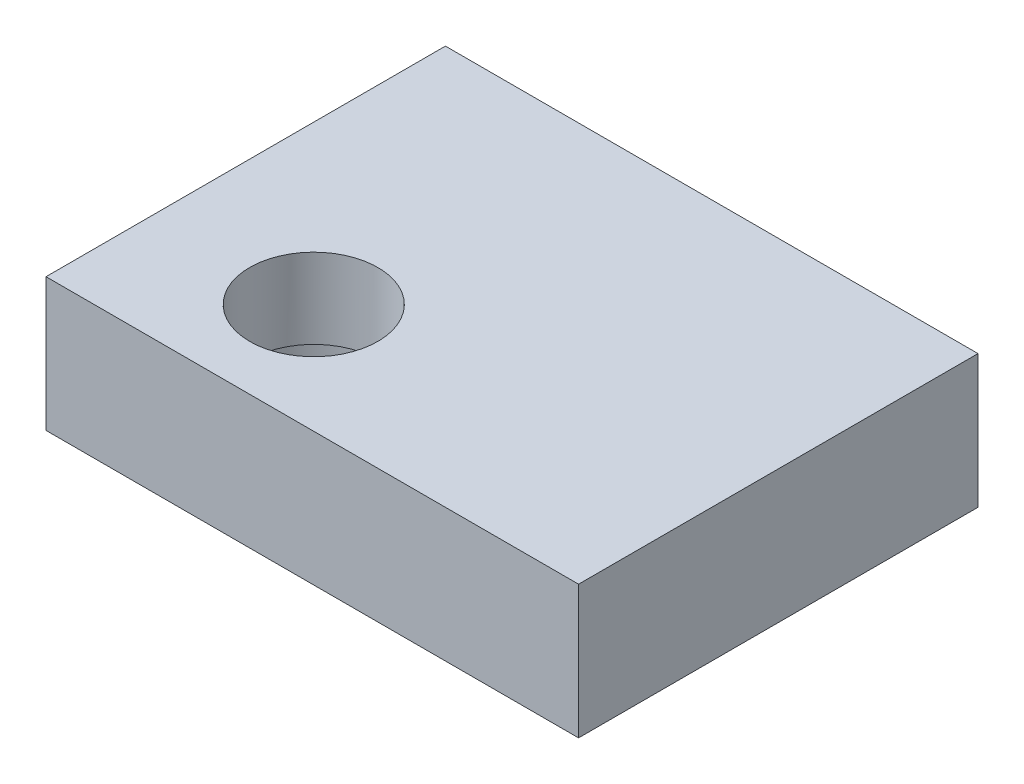
ISO-10303-21;
HEADER;
FILE_DESCRIPTION(('STEP AP214'),'2;1');
FILE_NAME('part.step','',(''),(''),'','','');
FILE_SCHEMA(('AUTOMOTIVE_DESIGN { 1 0 10303 214 1 1 1 1 }'));
ENDSEC;
DATA;
#1=APPLICATION_CONTEXT('core data for automotive mechanical design processes');
#2=APPLICATION_PROTOCOL_DEFINITION('international standard','automotive_design',2000,#1);
#3=PRODUCT_CONTEXT('',#1,'mechanical');
#4=PRODUCT('Part','Part','',(#3));
#5=PRODUCT_RELATED_PRODUCT_CATEGORY('part','',(#4));
#6=PRODUCT_DEFINITION_FORMATION('','',#4);
#7=PRODUCT_DEFINITION_CONTEXT('part definition',#1,'design');
#8=PRODUCT_DEFINITION('design','',#6,#7);
#9=PRODUCT_DEFINITION_SHAPE('','',#8);
#10=(LENGTH_UNIT() NAMED_UNIT(*) SI_UNIT(.MILLI.,.METRE.));
#11=(NAMED_UNIT(*) PLANE_ANGLE_UNIT() SI_UNIT($,.RADIAN.));
#12=(NAMED_UNIT(*) SI_UNIT($,.STERADIAN.) SOLID_ANGLE_UNIT());
#13=UNCERTAINTY_MEASURE_WITH_UNIT(LENGTH_MEASURE(1.E-05),#10,'distance_accuracy_value','');
#14=(GEOMETRIC_REPRESENTATION_CONTEXT(3) GLOBAL_UNCERTAINTY_ASSIGNED_CONTEXT((#13)) GLOBAL_UNIT_ASSIGNED_CONTEXT((#10,
#11,#12)) REPRESENTATION_CONTEXT('',''));
#15=CARTESIAN_POINT('',(0.,0.,0.));
#16=DIRECTION('',(0.,0.,1.));
#17=DIRECTION('',(1.,0.,0.));
#18=AXIS2_PLACEMENT_3D('',#15,#16,#17);
#19=CARTESIAN_POINT('',(20.,10.,15.));
#20=DIRECTION('',(-1.,0.,0.));
#21=DIRECTION('',(0.,0.,1.));
#22=AXIS2_PLACEMENT_3D('',#19,#20,#21);
#23=PLANE('',#22);
#24=DIRECTION('',(0.,0.,-1.));
#25=VECTOR('',#24,1.);
#26=CARTESIAN_POINT('',(20.,0.,15.));
#27=LINE('',#26,#25);
#28=CARTESIAN_POINT('',(20.,0.,15.));
#29=VERTEX_POINT('',#28);
#30=CARTESIAN_POINT('',(20.,0.,-15.));
#31=VERTEX_POINT('',#30);
#32=EDGE_CURVE('E113',#29,#31,#27,.T.);
#33=ORIENTED_EDGE('',*,*,#32,.T.);
#34=DIRECTION('',(0.,-1.,0.));
#35=VECTOR('',#34,1.);
#36=CARTESIAN_POINT('',(20.,10.,-15.));
#37=LINE('',#36,#35);
#38=CARTESIAN_POINT('',(20.,10.,-15.));
#39=VERTEX_POINT('',#38);
#40=EDGE_CURVE('E11',#39,#31,#37,.T.);
#41=ORIENTED_EDGE('',*,*,#40,.F.);
#42=DIRECTION('',(0.,0.,-1.));
#43=VECTOR('',#42,1.);
#44=CARTESIAN_POINT('',(20.,10.,15.));
#45=LINE('',#44,#43);
#46=CARTESIAN_POINT('',(20.,10.,15.));
#47=VERTEX_POINT('',#46);
#48=EDGE_CURVE('E96',#47,#39,#45,.T.);
#49=ORIENTED_EDGE('',*,*,#48,.F.);
#50=DIRECTION('',(0.,-1.,0.));
#51=VECTOR('',#50,1.);
#52=CARTESIAN_POINT('',(20.,10.,15.));
#53=LINE('',#52,#51);
#54=EDGE_CURVE('E109',#47,#29,#53,.T.);
#55=ORIENTED_EDGE('',*,*,#54,.T.);
#56=EDGE_LOOP('',(#33,#41,#49,#55));
#57=FACE_BOUND('',#56,.T.);
#58=ADVANCED_FACE('F43',(#57),#23,.F.);
#59=CARTESIAN_POINT('',(-20.,10.,-15.));
#60=DIRECTION('',(0.,0.,1.));
#61=DIRECTION('',(1.,0.,0.));
#62=AXIS2_PLACEMENT_3D('',#59,#60,#61);
#63=PLANE('',#62);
#64=DIRECTION('',(-1.,0.,0.));
#65=VECTOR('',#64,1.);
#66=CARTESIAN_POINT('',(-20.,0.,-15.));
#67=LINE('',#66,#65);
#68=CARTESIAN_POINT('',(-20.,0.,-15.));
#69=VERTEX_POINT('',#68);
#70=EDGE_CURVE('E101',#31,#69,#67,.T.);
#71=ORIENTED_EDGE('',*,*,#70,.T.);
#72=DIRECTION('',(0.,-1.,0.));
#73=VECTOR('',#72,1.);
#74=CARTESIAN_POINT('',(-20.,10.,-15.));
#75=LINE('',#74,#73);
#76=CARTESIAN_POINT('',(-20.,10.,-15.));
#77=VERTEX_POINT('',#76);
#78=EDGE_CURVE('E53',#77,#69,#75,.T.);
#79=ORIENTED_EDGE('',*,*,#78,.F.);
#80=DIRECTION('',(-1.,0.,0.));
#81=VECTOR('',#80,1.);
#82=CARTESIAN_POINT('',(-20.,10.,-15.));
#83=LINE('',#82,#81);
#84=EDGE_CURVE('E91',#39,#77,#83,.T.);
#85=ORIENTED_EDGE('',*,*,#84,.F.);
#86=ORIENTED_EDGE('',*,*,#40,.T.);
#87=EDGE_LOOP('',(#71,#79,#85,#86));
#88=FACE_BOUND('',#87,.T.);
#89=ADVANCED_FACE('F100',(#88),#63,.F.);
#90=CARTESIAN_POINT('',(-20.,10.,15.));
#91=DIRECTION('',(1.,0.,0.));
#92=DIRECTION('',(0.,0.,-1.));
#93=AXIS2_PLACEMENT_3D('',#90,#91,#92);
#94=PLANE('',#93);
#95=DIRECTION('',(0.,0.,1.));
#96=VECTOR('',#95,1.);
#97=CARTESIAN_POINT('',(-20.,0.,15.));
#98=LINE('',#97,#96);
#99=CARTESIAN_POINT('',(-20.,0.,15.));
#100=VERTEX_POINT('',#99);
#101=EDGE_CURVE('E78',#69,#100,#98,.T.);
#102=ORIENTED_EDGE('',*,*,#101,.T.);
#103=DIRECTION('',(0.,-1.,0.));
#104=VECTOR('',#103,1.);
#105=CARTESIAN_POINT('',(-20.,10.,15.));
#106=LINE('',#105,#104);
#107=CARTESIAN_POINT('',(-20.,10.,15.));
#108=VERTEX_POINT('',#107);
#109=EDGE_CURVE('E103',#108,#100,#106,.T.);
#110=ORIENTED_EDGE('',*,*,#109,.F.);
#111=DIRECTION('',(0.,0.,1.));
#112=VECTOR('',#111,1.);
#113=CARTESIAN_POINT('',(-20.,10.,15.));
#114=LINE('',#113,#112);
#115=EDGE_CURVE('E94',#77,#108,#114,.T.);
#116=ORIENTED_EDGE('',*,*,#115,.F.);
#117=ORIENTED_EDGE('',*,*,#78,.T.);
#118=EDGE_LOOP('',(#102,#110,#116,#117));
#119=FACE_BOUND('',#118,.T.);
#120=ADVANCED_FACE('F105',(#119),#94,.F.);
#121=CARTESIAN_POINT('',(-20.,10.,15.));
#122=DIRECTION('',(0.,0.,-1.));
#123=DIRECTION('',(-1.,0.,0.));
#124=AXIS2_PLACEMENT_3D('',#121,#122,#123);
#125=PLANE('',#124);
#126=DIRECTION('',(1.,0.,0.));
#127=VECTOR('',#126,1.);
#128=CARTESIAN_POINT('',(-20.,0.,15.));
#129=LINE('',#128,#127);
#130=EDGE_CURVE('E84',#100,#29,#129,.T.);
#131=ORIENTED_EDGE('',*,*,#130,.T.);
#132=ORIENTED_EDGE('',*,*,#54,.F.);
#133=DIRECTION('',(1.,0.,0.));
#134=VECTOR('',#133,1.);
#135=CARTESIAN_POINT('',(-20.,10.,15.));
#136=LINE('',#135,#134);
#137=EDGE_CURVE('E61',#108,#47,#136,.T.);
#138=ORIENTED_EDGE('',*,*,#137,.F.);
#139=ORIENTED_EDGE('',*,*,#109,.T.);
#140=EDGE_LOOP('',(#131,#132,#138,#139));
#141=FACE_BOUND('',#140,.T.);
#142=ADVANCED_FACE('F127',(#141),#125,.F.);
#143=CARTESIAN_POINT('',(0.,10.,0.));
#144=DIRECTION('',(0.,-1.,0.));
#145=DIRECTION('',(0.,0.,-1.));
#146=AXIS2_PLACEMENT_3D('',#143,#144,#145);
#147=PLANE('',#146);
#148=CARTESIAN_POINT('',(-8.14,10.,6.75));
#149=DIRECTION('',(0.,1.,0.));
#150=DIRECTION('',(0.,0.,1.));
#151=AXIS2_PLACEMENT_3D('',#148,#149,#150);
#152=CIRCLE('',#151,4.8125);
#153=CARTESIAN_POINT('',(-8.14,10.,11.5625));
#154=VERTEX_POINT('',#153);
#155=EDGE_CURVE('E165',#154,#154,#152,.T.);
#156=ORIENTED_EDGE('',*,*,#155,.F.);
#157=EDGE_LOOP('',(#156));
#158=FACE_BOUND('',#157,.T.);
#159=ORIENTED_EDGE('',*,*,#48,.T.);
#160=ORIENTED_EDGE('',*,*,#84,.T.);
#161=ORIENTED_EDGE('',*,*,#115,.T.);
#162=ORIENTED_EDGE('',*,*,#137,.T.);
#163=EDGE_LOOP('',(#159,#160,#161,#162));
#164=FACE_BOUND('',#163,.T.);
#165=ADVANCED_FACE('F92',(#158,#164),#147,.F.);
#166=CARTESIAN_POINT('',(0.,0.,0.));
#167=DIRECTION('',(0.,-1.,0.));
#168=DIRECTION('',(0.,0.,-1.));
#169=AXIS2_PLACEMENT_3D('',#166,#167,#168);
#170=PLANE('',#169);
#171=CARTESIAN_POINT('',(-8.14,0.,6.75));
#172=DIRECTION('',(0.,-1.,0.));
#173=DIRECTION('',(0.,0.,-1.));
#174=AXIS2_PLACEMENT_3D('',#171,#172,#173);
#175=CIRCLE('',#174,6.3);
#176=CARTESIAN_POINT('',(-8.14,0.,0.449999999999997));
#177=VERTEX_POINT('',#176);
#178=EDGE_CURVE('E146',#177,#177,#175,.T.);
#179=ORIENTED_EDGE('',*,*,#178,.F.);
#180=EDGE_LOOP('',(#179));
#181=FACE_BOUND('',#180,.T.);
#182=CARTESIAN_POINT('',(-13.3333333333333,0.,-10.));
#183=DIRECTION('',(0.,-1.,0.));
#184=DIRECTION('',(0.,0.,-1.));
#185=AXIS2_PLACEMENT_3D('',#182,#183,#184);
#186=CIRCLE('',#185,1.55);
#187=CARTESIAN_POINT('',(-13.3333333333333,0.,-11.55));
#188=VERTEX_POINT('',#187);
#189=EDGE_CURVE('E154',#188,#188,#186,.T.);
#190=ORIENTED_EDGE('',*,*,#189,.F.);
#191=EDGE_LOOP('',(#190));
#192=FACE_BOUND('',#191,.T.);
#193=CARTESIAN_POINT('',(13.3333333333333,0.,-10.));
#194=DIRECTION('',(0.,-1.,0.));
#195=DIRECTION('',(0.,0.,1.));
#196=AXIS2_PLACEMENT_3D('',#193,#194,#195);
#197=CIRCLE('',#196,1.55);
#198=CARTESIAN_POINT('',(13.3333333333333,0.,-8.45));
#199=VERTEX_POINT('',#198);
#200=EDGE_CURVE('E138',#199,#199,#197,.T.);
#201=ORIENTED_EDGE('',*,*,#200,.F.);
#202=EDGE_LOOP('',(#201));
#203=FACE_BOUND('',#202,.T.);
#204=CARTESIAN_POINT('',(13.3333333333333,0.,10.));
#205=DIRECTION('',(0.,-1.,0.));
#206=DIRECTION('',(0.,0.,-1.));
#207=AXIS2_PLACEMENT_3D('',#204,#205,#206);
#208=CIRCLE('',#207,1.55);
#209=CARTESIAN_POINT('',(13.3333333333333,0.,8.45));
#210=VERTEX_POINT('',#209);
#211=EDGE_CURVE('E134',#210,#210,#208,.T.);
#212=ORIENTED_EDGE('',*,*,#211,.F.);
#213=EDGE_LOOP('',(#212));
#214=FACE_BOUND('',#213,.T.);
#215=ORIENTED_EDGE('',*,*,#32,.F.);
#216=ORIENTED_EDGE('',*,*,#130,.F.);
#217=ORIENTED_EDGE('',*,*,#101,.F.);
#218=ORIENTED_EDGE('',*,*,#70,.F.);
#219=EDGE_LOOP('',(#215,#216,#217,#218));
#220=FACE_BOUND('',#219,.T.);
#221=ADVANCED_FACE('F130',(#181,#192,#203,#214,#220),#170,.T.);
#222=CARTESIAN_POINT('',(13.3333333333333,4.,10.));
#223=DIRECTION('',(0.,-1.,0.));
#224=DIRECTION('',(0.,0.,-1.));
#225=AXIS2_PLACEMENT_3D('',#222,#223,#224);
#226=CYLINDRICAL_SURFACE('',#225,1.55);
#227=CARTESIAN_POINT('',(13.3333333333333,4.,10.));
#228=DIRECTION('',(0.,-1.,0.));
#229=DIRECTION('',(0.,0.,-1.));
#230=AXIS2_PLACEMENT_3D('',#227,#228,#229);
#231=CIRCLE('',#230,1.55);
#232=CARTESIAN_POINT('',(13.3333333333333,4.,8.45));
#233=VERTEX_POINT('',#232);
#234=EDGE_CURVE('E117',#233,#233,#231,.T.);
#235=ORIENTED_EDGE('',*,*,#234,.F.);
#236=EDGE_LOOP('',(#235));
#237=FACE_BOUND('',#236,.T.);
#238=ORIENTED_EDGE('',*,*,#211,.T.);
#239=EDGE_LOOP('',(#238));
#240=FACE_BOUND('',#239,.T.);
#241=ADVANCED_FACE('F191',(#237,#240),#226,.F.);
#242=CARTESIAN_POINT('',(13.3333333333333,4.,10.));
#243=DIRECTION('',(0.,-1.,0.));
#244=DIRECTION('',(0.,0.,-1.));
#245=AXIS2_PLACEMENT_3D('',#242,#243,#244);
#246=PLANE('',#245);
#247=ORIENTED_EDGE('',*,*,#234,.T.);
#248=EDGE_LOOP('',(#247));
#249=FACE_BOUND('',#248,.T.);
#250=ADVANCED_FACE('F200',(#249),#246,.T.);
#251=CARTESIAN_POINT('',(13.3333333333333,4.,-10.));
#252=DIRECTION('',(0.,-1.,0.));
#253=DIRECTION('',(0.,0.,-1.));
#254=AXIS2_PLACEMENT_3D('',#251,#252,#253);
#255=CYLINDRICAL_SURFACE('',#254,1.55);
#256=CARTESIAN_POINT('',(13.3333333333333,4.,-10.));
#257=DIRECTION('',(0.,-1.,0.));
#258=DIRECTION('',(0.,0.,1.));
#259=AXIS2_PLACEMENT_3D('',#256,#257,#258);
#260=CIRCLE('',#259,1.55);
#261=CARTESIAN_POINT('',(13.3333333333333,4.,-8.45));
#262=VERTEX_POINT('',#261);
#263=EDGE_CURVE('E158',#262,#262,#260,.T.);
#264=ORIENTED_EDGE('',*,*,#263,.F.);
#265=EDGE_LOOP('',(#264));
#266=FACE_BOUND('',#265,.T.);
#267=ORIENTED_EDGE('',*,*,#200,.T.);
#268=EDGE_LOOP('',(#267));
#269=FACE_BOUND('',#268,.T.);
#270=ADVANCED_FACE('F206',(#266,#269),#255,.F.);
#271=CARTESIAN_POINT('',(13.3333333333333,4.,-10.));
#272=DIRECTION('',(0.,1.,0.));
#273=DIRECTION('',(0.,0.,1.));
#274=AXIS2_PLACEMENT_3D('',#271,#272,#273);
#275=PLANE('',#274);
#276=ORIENTED_EDGE('',*,*,#263,.T.);
#277=EDGE_LOOP('',(#276));
#278=FACE_BOUND('',#277,.T.);
#279=ADVANCED_FACE('F258',(#278),#275,.F.);
#280=CARTESIAN_POINT('',(-13.3333333333333,4.,-10.));
#281=DIRECTION('',(0.,-1.,0.));
#282=DIRECTION('',(0.,0.,-1.));
#283=AXIS2_PLACEMENT_3D('',#280,#281,#282);
#284=CYLINDRICAL_SURFACE('',#283,1.55);
#285=CARTESIAN_POINT('',(-13.3333333333333,4.,-10.));
#286=DIRECTION('',(0.,-1.,0.));
#287=DIRECTION('',(0.,0.,-1.));
#288=AXIS2_PLACEMENT_3D('',#285,#286,#287);
#289=CIRCLE('',#288,1.55);
#290=CARTESIAN_POINT('',(-13.3333333333333,4.,-11.55));
#291=VERTEX_POINT('',#290);
#292=EDGE_CURVE('E150',#291,#291,#289,.T.);
#293=ORIENTED_EDGE('',*,*,#292,.F.);
#294=EDGE_LOOP('',(#293));
#295=FACE_BOUND('',#294,.T.);
#296=ORIENTED_EDGE('',*,*,#189,.T.);
#297=EDGE_LOOP('',(#296));
#298=FACE_BOUND('',#297,.T.);
#299=ADVANCED_FACE('F269',(#295,#298),#284,.F.);
#300=CARTESIAN_POINT('',(-13.3333333333333,4.,-10.));
#301=DIRECTION('',(0.,-1.,0.));
#302=DIRECTION('',(0.,0.,-1.));
#303=AXIS2_PLACEMENT_3D('',#300,#301,#302);
#304=PLANE('',#303);
#305=ORIENTED_EDGE('',*,*,#292,.T.);
#306=EDGE_LOOP('',(#305));
#307=FACE_BOUND('',#306,.T.);
#308=ADVANCED_FACE('F185',(#307),#304,.T.);
#309=CARTESIAN_POINT('',(-8.14,4.,6.75));
#310=DIRECTION('',(0.,-1.,0.));
#311=DIRECTION('',(0.,0.,-1.));
#312=AXIS2_PLACEMENT_3D('',#309,#310,#311);
#313=CYLINDRICAL_SURFACE('',#312,6.3);
#314=CARTESIAN_POINT('',(-8.14,4.,6.75));
#315=DIRECTION('',(0.,-1.,0.));
#316=DIRECTION('',(0.,0.,-1.));
#317=AXIS2_PLACEMENT_3D('',#314,#315,#316);
#318=CIRCLE('',#317,6.3);
#319=CARTESIAN_POINT('',(-8.14,4.,0.449999999999997));
#320=VERTEX_POINT('',#319);
#321=EDGE_CURVE('E142',#320,#320,#318,.T.);
#322=ORIENTED_EDGE('',*,*,#321,.F.);
#323=EDGE_LOOP('',(#322));
#324=FACE_BOUND('',#323,.T.);
#325=ORIENTED_EDGE('',*,*,#178,.T.);
#326=EDGE_LOOP('',(#325));
#327=FACE_BOUND('',#326,.T.);
#328=ADVANCED_FACE('F179',(#324,#327),#313,.F.);
#329=CARTESIAN_POINT('',(-8.14,4.,6.75));
#330=DIRECTION('',(0.,-1.,0.));
#331=DIRECTION('',(0.,0.,-1.));
#332=AXIS2_PLACEMENT_3D('',#329,#330,#331);
#333=PLANE('',#332);
#334=CARTESIAN_POINT('',(-8.14,4.,6.75));
#335=DIRECTION('',(0.,-1.,0.));
#336=DIRECTION('',(0.,0.,-1.));
#337=AXIS2_PLACEMENT_3D('',#334,#335,#336);
#338=CIRCLE('',#337,4.8125);
#339=CARTESIAN_POINT('',(-8.14,4.,1.9375));
#340=VERTEX_POINT('',#339);
#341=EDGE_CURVE('E46',#340,#340,#338,.T.);
#342=ORIENTED_EDGE('',*,*,#341,.F.);
#343=EDGE_LOOP('',(#342));
#344=FACE_BOUND('',#343,.T.);
#345=ORIENTED_EDGE('',*,*,#321,.T.);
#346=EDGE_LOOP('',(#345));
#347=FACE_BOUND('',#346,.T.);
#348=ADVANCED_FACE('F176',(#344,#347),#333,.T.);
#349=CARTESIAN_POINT('',(-8.14,-13.611805537841,6.75));
#350=DIRECTION('',(0.,1.,0.));
#351=DIRECTION('',(0.,0.,1.));
#352=AXIS2_PLACEMENT_3D('',#349,#350,#351);
#353=CYLINDRICAL_SURFACE('',#352,4.8125);
#354=ORIENTED_EDGE('',*,*,#341,.T.);
#355=EDGE_LOOP('',(#354));
#356=FACE_BOUND('',#355,.T.);
#357=ORIENTED_EDGE('',*,*,#155,.T.);
#358=EDGE_LOOP('',(#357));
#359=FACE_BOUND('',#358,.T.);
#360=ADVANCED_FACE('F174',(#356,#359),#353,.F.);
#361=CLOSED_SHELL('',(#58,#89,#120,#142,#165,#221,#241,#250,#270,#279,#299,#308,#328,#348,#360));
#362=MANIFOLD_SOLID_BREP('B2',#361);
#363=ADVANCED_BREP_SHAPE_REPRESENTATION('',(#18,#362),#14);
#364=SHAPE_DEFINITION_REPRESENTATION(#9,#363);
ENDSEC;
END-ISO-10303-21;
